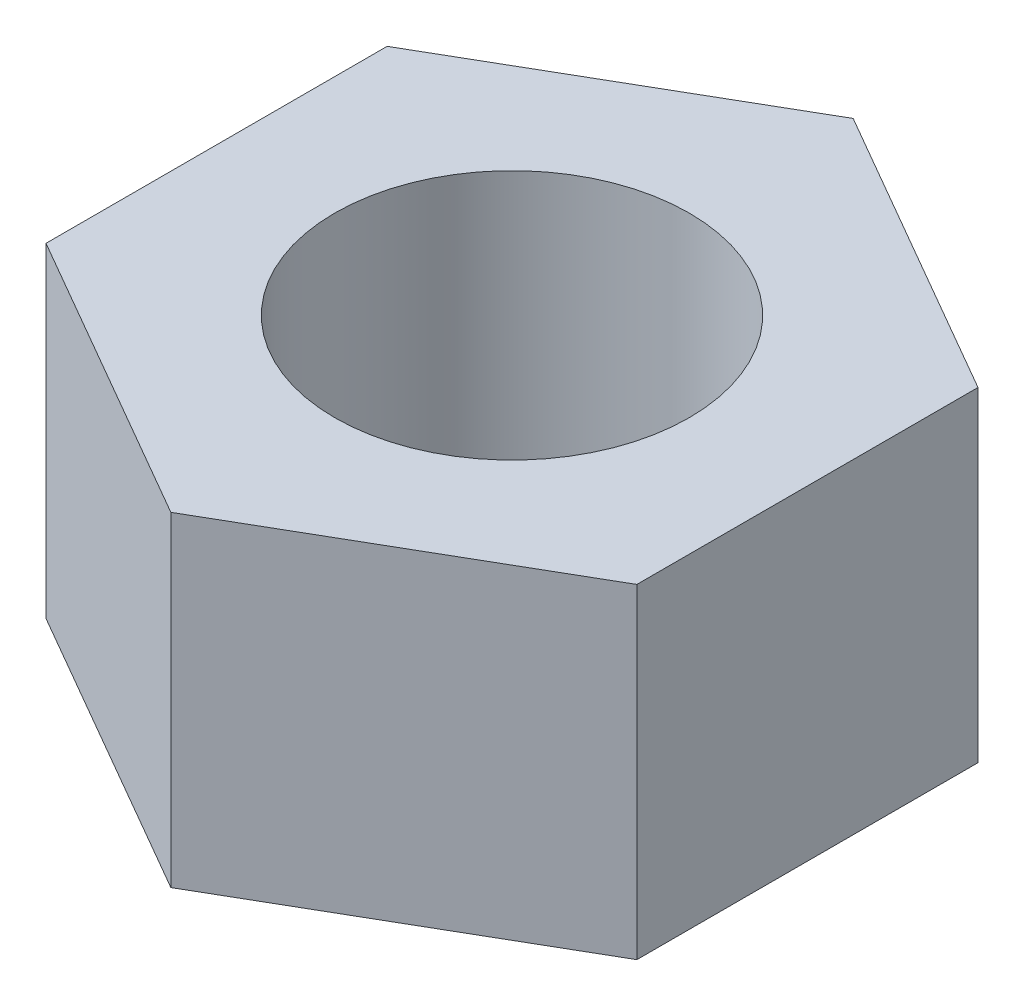
ISO-10303-21;
HEADER;
FILE_DESCRIPTION(('STEP AP214'),'2;1');
FILE_NAME('part.step','',(''),(''),'','','');
FILE_SCHEMA(('AUTOMOTIVE_DESIGN { 1 0 10303 214 1 1 1 1 }'));
ENDSEC;
DATA;
#1=APPLICATION_CONTEXT('core data for automotive mechanical design processes');
#2=APPLICATION_PROTOCOL_DEFINITION('international standard','automotive_design',2000,#1);
#3=PRODUCT_CONTEXT('',#1,'mechanical');
#4=PRODUCT('Part','Part','',(#3));
#5=PRODUCT_RELATED_PRODUCT_CATEGORY('part','',(#4));
#6=PRODUCT_DEFINITION_FORMATION('','',#4);
#7=PRODUCT_DEFINITION_CONTEXT('part definition',#1,'design');
#8=PRODUCT_DEFINITION('design','',#6,#7);
#9=PRODUCT_DEFINITION_SHAPE('','',#8);
#10=(LENGTH_UNIT() NAMED_UNIT(*) SI_UNIT(.MILLI.,.METRE.));
#11=(NAMED_UNIT(*) PLANE_ANGLE_UNIT() SI_UNIT($,.RADIAN.));
#12=(NAMED_UNIT(*) SI_UNIT($,.STERADIAN.) SOLID_ANGLE_UNIT());
#13=UNCERTAINTY_MEASURE_WITH_UNIT(LENGTH_MEASURE(1.E-05),#10,'distance_accuracy_value','');
#14=(GEOMETRIC_REPRESENTATION_CONTEXT(3) GLOBAL_UNCERTAINTY_ASSIGNED_CONTEXT((#13)) GLOBAL_UNIT_ASSIGNED_CONTEXT((#10,
#11,#12)) REPRESENTATION_CONTEXT('',''));
#15=CARTESIAN_POINT('',(0.,0.,0.));
#16=DIRECTION('',(0.,0.,1.));
#17=DIRECTION('',(1.,0.,0.));
#18=AXIS2_PLACEMENT_3D('',#15,#16,#17);
#19=CARTESIAN_POINT('',(0.,5.5,5.77350269189626));
#20=DIRECTION('',(0.,1.,0.));
#21=DIRECTION('',(0.,0.,1.));
#22=AXIS2_PLACEMENT_3D('',#19,#20,#21);
#23=PLANE('',#22);
#24=DIRECTION('',(0.866025403784438,0.,0.5));
#25=VECTOR('',#24,1.);
#26=CARTESIAN_POINT('',(-5.,5.5,2.88675134594813));
#27=LINE('',#26,#25);
#28=CARTESIAN_POINT('',(-5.,5.5,2.88675134594813));
#29=VERTEX_POINT('',#28);
#30=CARTESIAN_POINT('',(0.,5.5,5.77350269189626));
#31=VERTEX_POINT('',#30);
#32=EDGE_CURVE('E128',#29,#31,#27,.T.);
#33=ORIENTED_EDGE('',*,*,#32,.T.);
#34=DIRECTION('',(0.866025403784439,0.,-0.5));
#35=VECTOR('',#34,1.);
#36=CARTESIAN_POINT('',(0.,5.5,5.77350269189626));
#37=LINE('',#36,#35);
#38=CARTESIAN_POINT('',(5.,5.5,2.88675134594813));
#39=VERTEX_POINT('',#38);
#40=EDGE_CURVE('E86',#31,#39,#37,.T.);
#41=ORIENTED_EDGE('',*,*,#40,.T.);
#42=DIRECTION('',(0.,0.,-1.));
#43=VECTOR('',#42,1.);
#44=CARTESIAN_POINT('',(5.,5.5,2.88675134594813));
#45=LINE('',#44,#43);
#46=CARTESIAN_POINT('',(5.,5.5,-2.88675134594813));
#47=VERTEX_POINT('',#46);
#48=EDGE_CURVE('E99',#39,#47,#45,.T.);
#49=ORIENTED_EDGE('',*,*,#48,.T.);
#50=DIRECTION('',(-0.866025403784439,0.,-0.5));
#51=VECTOR('',#50,1.);
#52=CARTESIAN_POINT('',(5.,5.5,-2.88675134594813));
#53=LINE('',#52,#51);
#54=CARTESIAN_POINT('',(0.,5.5,-5.77350269189626));
#55=VERTEX_POINT('',#54);
#56=EDGE_CURVE('E93',#47,#55,#53,.T.);
#57=ORIENTED_EDGE('',*,*,#56,.T.);
#58=DIRECTION('',(-0.866025403784439,0.,0.5));
#59=VECTOR('',#58,1.);
#60=CARTESIAN_POINT('',(0.,5.5,-5.77350269189626));
#61=LINE('',#60,#59);
#62=CARTESIAN_POINT('',(-5.,5.5,-2.88675134594813));
#63=VERTEX_POINT('',#62);
#64=EDGE_CURVE('E97',#55,#63,#61,.T.);
#65=ORIENTED_EDGE('',*,*,#64,.T.);
#66=DIRECTION('',(0.,0.,1.));
#67=VECTOR('',#66,1.);
#68=CARTESIAN_POINT('',(-5.,5.5,-2.88675134594813));
#69=LINE('',#68,#67);
#70=EDGE_CURVE('E49',#63,#29,#69,.T.);
#71=ORIENTED_EDGE('',*,*,#70,.T.);
#72=EDGE_LOOP('',(#33,#41,#49,#57,#65,#71));
#73=FACE_BOUND('',#72,.T.);
#74=CARTESIAN_POINT('',(0.,5.5,0.));
#75=DIRECTION('',(0.,1.,0.));
#76=DIRECTION('',(0.,0.,1.));
#77=AXIS2_PLACEMENT_3D('',#74,#75,#76);
#78=CIRCLE('',#77,3.);
#79=CARTESIAN_POINT('',(0.,5.5,3.));
#80=VERTEX_POINT('',#79);
#81=EDGE_CURVE('E121',#80,#80,#78,.T.);
#82=ORIENTED_EDGE('',*,*,#81,.F.);
#83=EDGE_LOOP('',(#82));
#84=FACE_BOUND('',#83,.T.);
#85=ADVANCED_FACE('F32',(#73,#84),#23,.T.);
#86=CARTESIAN_POINT('',(0.,0.,5.77350269189626));
#87=DIRECTION('',(0.,1.,0.));
#88=DIRECTION('',(0.,0.,1.));
#89=AXIS2_PLACEMENT_3D('',#86,#87,#88);
#90=PLANE('',#89);
#91=DIRECTION('',(0.866025403784438,0.,0.5));
#92=VECTOR('',#91,1.);
#93=CARTESIAN_POINT('',(-5.,0.,2.88675134594813));
#94=LINE('',#93,#92);
#95=CARTESIAN_POINT('',(-5.,0.,2.88675134594813));
#96=VERTEX_POINT('',#95);
#97=CARTESIAN_POINT('',(0.,0.,5.77350269189626));
#98=VERTEX_POINT('',#97);
#99=EDGE_CURVE('E117',#96,#98,#94,.T.);
#100=ORIENTED_EDGE('',*,*,#99,.F.);
#101=DIRECTION('',(0.,0.,1.));
#102=VECTOR('',#101,1.);
#103=CARTESIAN_POINT('',(-5.,0.,-2.88675134594813));
#104=LINE('',#103,#102);
#105=CARTESIAN_POINT('',(-5.,0.,-2.88675134594813));
#106=VERTEX_POINT('',#105);
#107=EDGE_CURVE('E78',#106,#96,#104,.T.);
#108=ORIENTED_EDGE('',*,*,#107,.F.);
#109=DIRECTION('',(-0.866025403784439,0.,0.5));
#110=VECTOR('',#109,1.);
#111=CARTESIAN_POINT('',(0.,0.,-5.77350269189626));
#112=LINE('',#111,#110);
#113=CARTESIAN_POINT('',(0.,0.,-5.77350269189626));
#114=VERTEX_POINT('',#113);
#115=EDGE_CURVE('E72',#114,#106,#112,.T.);
#116=ORIENTED_EDGE('',*,*,#115,.F.);
#117=DIRECTION('',(-0.866025403784439,0.,-0.5));
#118=VECTOR('',#117,1.);
#119=CARTESIAN_POINT('',(5.,0.,-2.88675134594813));
#120=LINE('',#119,#118);
#121=CARTESIAN_POINT('',(5.,0.,-2.88675134594813));
#122=VERTEX_POINT('',#121);
#123=EDGE_CURVE('E107',#122,#114,#120,.T.);
#124=ORIENTED_EDGE('',*,*,#123,.F.);
#125=DIRECTION('',(0.,0.,-1.));
#126=VECTOR('',#125,1.);
#127=CARTESIAN_POINT('',(5.,0.,2.88675134594813));
#128=LINE('',#127,#126);
#129=CARTESIAN_POINT('',(5.,0.,2.88675134594813));
#130=VERTEX_POINT('',#129);
#131=EDGE_CURVE('E123',#130,#122,#128,.T.);
#132=ORIENTED_EDGE('',*,*,#131,.F.);
#133=DIRECTION('',(0.866025403784439,0.,-0.5));
#134=VECTOR('',#133,1.);
#135=CARTESIAN_POINT('',(0.,0.,5.77350269189626));
#136=LINE('',#135,#134);
#137=EDGE_CURVE('E120',#98,#130,#136,.T.);
#138=ORIENTED_EDGE('',*,*,#137,.F.);
#139=EDGE_LOOP('',(#100,#108,#116,#124,#132,#138));
#140=FACE_BOUND('',#139,.T.);
#141=CARTESIAN_POINT('',(0.,0.,0.));
#142=DIRECTION('',(0.,1.,0.));
#143=DIRECTION('',(0.,0.,1.));
#144=AXIS2_PLACEMENT_3D('',#141,#142,#143);
#145=CIRCLE('',#144,3.);
#146=CARTESIAN_POINT('',(0.,0.,3.));
#147=VERTEX_POINT('',#146);
#148=EDGE_CURVE('E221',#147,#147,#145,.T.);
#149=ORIENTED_EDGE('',*,*,#148,.T.);
#150=EDGE_LOOP('',(#149));
#151=FACE_BOUND('',#150,.T.);
#152=ADVANCED_FACE('F137',(#140,#151),#90,.F.);
#153=CARTESIAN_POINT('',(-5.,5.5,2.88675134594813));
#154=DIRECTION('',(0.5,0.,-0.866025403784439));
#155=DIRECTION('',(-0.866025403784439,0.,-0.5));
#156=AXIS2_PLACEMENT_3D('',#153,#154,#155);
#157=PLANE('',#156);
#158=ORIENTED_EDGE('',*,*,#99,.T.);
#159=DIRECTION('',(0.,-1.,0.));
#160=VECTOR('',#159,1.);
#161=CARTESIAN_POINT('',(0.,5.5,5.77350269189626));
#162=LINE('',#161,#160);
#163=EDGE_CURVE('E11',#31,#98,#162,.T.);
#164=ORIENTED_EDGE('',*,*,#163,.F.);
#165=ORIENTED_EDGE('',*,*,#32,.F.);
#166=DIRECTION('',(0.,-1.,0.));
#167=VECTOR('',#166,1.);
#168=CARTESIAN_POINT('',(-5.,5.5,2.88675134594813));
#169=LINE('',#168,#167);
#170=EDGE_CURVE('E113',#29,#96,#169,.T.);
#171=ORIENTED_EDGE('',*,*,#170,.T.);
#172=EDGE_LOOP('',(#158,#164,#165,#171));
#173=FACE_BOUND('',#172,.T.);
#174=ADVANCED_FACE('F34',(#173),#157,.F.);
#175=CARTESIAN_POINT('',(0.,5.5,5.77350269189626));
#176=DIRECTION('',(-0.5,0.,-0.866025403784439));
#177=DIRECTION('',(-0.866025403784439,0.,0.5));
#178=AXIS2_PLACEMENT_3D('',#175,#176,#177);
#179=PLANE('',#178);
#180=ORIENTED_EDGE('',*,*,#137,.T.);
#181=DIRECTION('',(0.,-1.,0.));
#182=VECTOR('',#181,1.);
#183=CARTESIAN_POINT('',(5.,5.5,2.88675134594813));
#184=LINE('',#183,#182);
#185=EDGE_CURVE('E41',#39,#130,#184,.T.);
#186=ORIENTED_EDGE('',*,*,#185,.F.);
#187=ORIENTED_EDGE('',*,*,#40,.F.);
#188=ORIENTED_EDGE('',*,*,#163,.T.);
#189=EDGE_LOOP('',(#180,#186,#187,#188));
#190=FACE_BOUND('',#189,.T.);
#191=ADVANCED_FACE('F162',(#190),#179,.F.);
#192=CARTESIAN_POINT('',(5.,5.5,2.88675134594813));
#193=DIRECTION('',(-1.,0.,0.));
#194=DIRECTION('',(0.,0.,1.));
#195=AXIS2_PLACEMENT_3D('',#192,#193,#194);
#196=PLANE('',#195);
#197=ORIENTED_EDGE('',*,*,#131,.T.);
#198=DIRECTION('',(0.,-1.,0.));
#199=VECTOR('',#198,1.);
#200=CARTESIAN_POINT('',(5.,5.5,-2.88675134594813));
#201=LINE('',#200,#199);
#202=EDGE_CURVE('E108',#47,#122,#201,.T.);
#203=ORIENTED_EDGE('',*,*,#202,.F.);
#204=ORIENTED_EDGE('',*,*,#48,.F.);
#205=ORIENTED_EDGE('',*,*,#185,.T.);
#206=EDGE_LOOP('',(#197,#203,#204,#205));
#207=FACE_BOUND('',#206,.T.);
#208=ADVANCED_FACE('F134',(#207),#196,.F.);
#209=CARTESIAN_POINT('',(5.,5.5,-2.88675134594813));
#210=DIRECTION('',(-0.5,0.,0.866025403784439));
#211=DIRECTION('',(0.866025403784439,0.,0.5));
#212=AXIS2_PLACEMENT_3D('',#209,#210,#211);
#213=PLANE('',#212);
#214=ORIENTED_EDGE('',*,*,#123,.T.);
#215=DIRECTION('',(0.,-1.,0.));
#216=VECTOR('',#215,1.);
#217=CARTESIAN_POINT('',(0.,5.5,-5.77350269189626));
#218=LINE('',#217,#216);
#219=EDGE_CURVE('E104',#55,#114,#218,.T.);
#220=ORIENTED_EDGE('',*,*,#219,.F.);
#221=ORIENTED_EDGE('',*,*,#56,.F.);
#222=ORIENTED_EDGE('',*,*,#202,.T.);
#223=EDGE_LOOP('',(#214,#220,#221,#222));
#224=FACE_BOUND('',#223,.T.);
#225=ADVANCED_FACE('F105',(#224),#213,.F.);
#226=CARTESIAN_POINT('',(0.,5.5,-5.77350269189626));
#227=DIRECTION('',(0.5,0.,0.866025403784439));
#228=DIRECTION('',(0.866025403784439,0.,-0.5));
#229=AXIS2_PLACEMENT_3D('',#226,#227,#228);
#230=PLANE('',#229);
#231=ORIENTED_EDGE('',*,*,#115,.T.);
#232=DIRECTION('',(0.,-1.,0.));
#233=VECTOR('',#232,1.);
#234=CARTESIAN_POINT('',(-5.,5.5,-2.88675134594813));
#235=LINE('',#234,#233);
#236=EDGE_CURVE('E109',#63,#106,#235,.T.);
#237=ORIENTED_EDGE('',*,*,#236,.F.);
#238=ORIENTED_EDGE('',*,*,#64,.F.);
#239=ORIENTED_EDGE('',*,*,#219,.T.);
#240=EDGE_LOOP('',(#231,#237,#238,#239));
#241=FACE_BOUND('',#240,.T.);
#242=ADVANCED_FACE('F111',(#241),#230,.F.);
#243=CARTESIAN_POINT('',(-5.,5.5,-2.88675134594813));
#244=DIRECTION('',(1.,0.,0.));
#245=DIRECTION('',(0.,0.,-1.));
#246=AXIS2_PLACEMENT_3D('',#243,#244,#245);
#247=PLANE('',#246);
#248=ORIENTED_EDGE('',*,*,#107,.T.);
#249=ORIENTED_EDGE('',*,*,#170,.F.);
#250=ORIENTED_EDGE('',*,*,#70,.F.);
#251=ORIENTED_EDGE('',*,*,#236,.T.);
#252=EDGE_LOOP('',(#248,#249,#250,#251));
#253=FACE_BOUND('',#252,.T.);
#254=ADVANCED_FACE('F142',(#253),#247,.F.);
#255=CARTESIAN_POINT('',(0.,5.5,0.));
#256=DIRECTION('',(0.,-1.,0.));
#257=DIRECTION('',(0.,0.,-1.));
#258=AXIS2_PLACEMENT_3D('',#255,#256,#257);
#259=CYLINDRICAL_SURFACE('',#258,3.);
#260=ORIENTED_EDGE('',*,*,#81,.T.);
#261=EDGE_LOOP('',(#260));
#262=FACE_BOUND('',#261,.T.);
#263=ORIENTED_EDGE('',*,*,#148,.F.);
#264=EDGE_LOOP('',(#263));
#265=FACE_BOUND('',#264,.T.);
#266=ADVANCED_FACE('F144',(#262,#265),#259,.F.);
#267=CLOSED_SHELL('',(#85,#152,#174,#191,#208,#225,#242,#254,#266));
#268=MANIFOLD_SOLID_BREP('B2',#267);
#269=ADVANCED_BREP_SHAPE_REPRESENTATION('',(#18,#268),#14);
#270=SHAPE_DEFINITION_REPRESENTATION(#9,#269);
ENDSEC;
END-ISO-10303-21;
